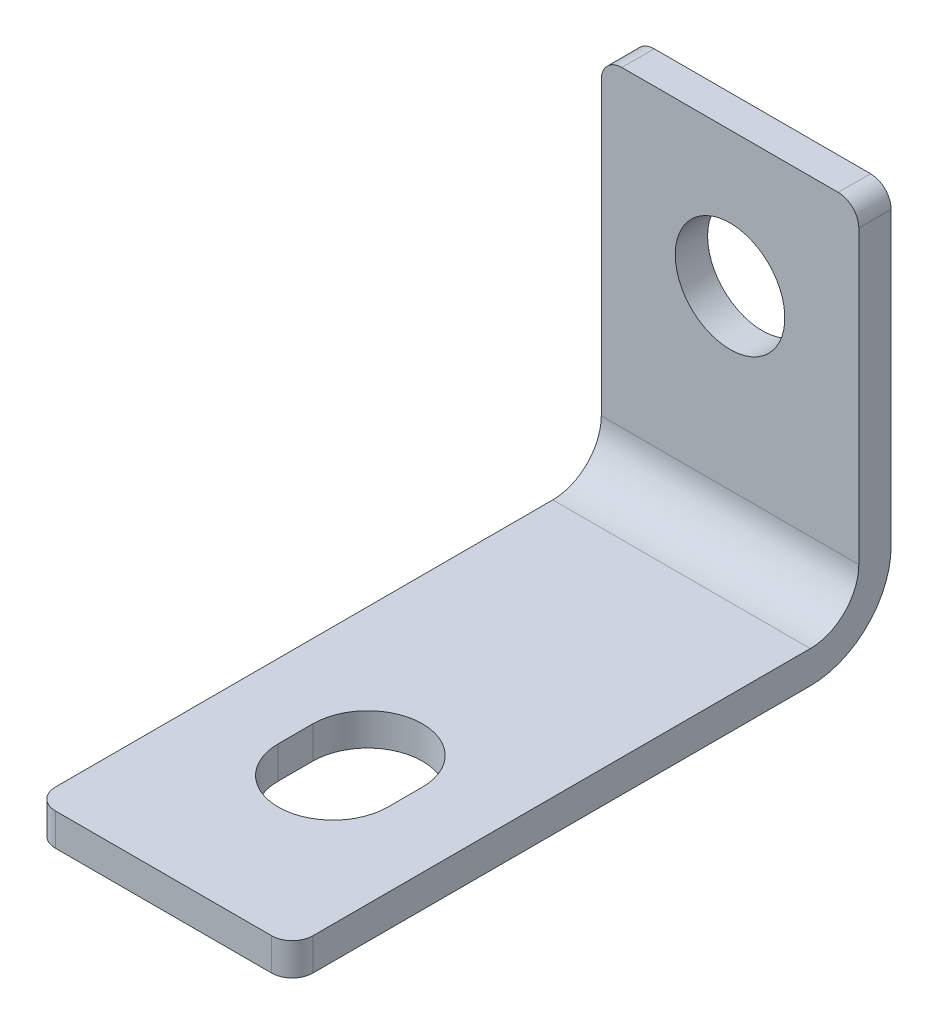
ISO-10303-21;
HEADER;
FILE_DESCRIPTION(('STEP AP214'),'2;1');
FILE_NAME('part.step','',(''),(''),'','','');
FILE_SCHEMA(('AUTOMOTIVE_DESIGN { 1 0 10303 214 1 1 1 1 }'));
ENDSEC;
DATA;
#1=APPLICATION_CONTEXT('core data for automotive mechanical design processes');
#2=APPLICATION_PROTOCOL_DEFINITION('international standard','automotive_design',2000,#1);
#3=PRODUCT_CONTEXT('',#1,'mechanical');
#4=PRODUCT('Part','Part','',(#3));
#5=PRODUCT_RELATED_PRODUCT_CATEGORY('part','',(#4));
#6=PRODUCT_DEFINITION_FORMATION('','',#4);
#7=PRODUCT_DEFINITION_CONTEXT('part definition',#1,'design');
#8=PRODUCT_DEFINITION('design','',#6,#7);
#9=PRODUCT_DEFINITION_SHAPE('','',#8);
#10=(LENGTH_UNIT() NAMED_UNIT(*) SI_UNIT(.MILLI.,.METRE.));
#11=(NAMED_UNIT(*) PLANE_ANGLE_UNIT() SI_UNIT($,.RADIAN.));
#12=(NAMED_UNIT(*) SI_UNIT($,.STERADIAN.) SOLID_ANGLE_UNIT());
#13=UNCERTAINTY_MEASURE_WITH_UNIT(LENGTH_MEASURE(1.E-05),#10,'distance_accuracy_value','');
#14=(GEOMETRIC_REPRESENTATION_CONTEXT(3) GLOBAL_UNCERTAINTY_ASSIGNED_CONTEXT((#13)) GLOBAL_UNIT_ASSIGNED_CONTEXT((#10,
#11,#12)) REPRESENTATION_CONTEXT('',''));
#15=CARTESIAN_POINT('',(0.,0.,0.));
#16=DIRECTION('',(0.,0.,1.));
#17=DIRECTION('',(1.,0.,0.));
#18=AXIS2_PLACEMENT_3D('',#15,#16,#17);
#19=CARTESIAN_POINT('',(15.875,0.,-1.9939));
#20=DIRECTION('',(0.,0.,1.));
#21=DIRECTION('',(1.,0.,0.));
#22=AXIS2_PLACEMENT_3D('',#19,#20,#21);
#23=PLANE('',#22);
#24=CARTESIAN_POINT('',(14.605,20.955,-1.9939));
#25=DIRECTION('',(0.,0.,-1.));
#26=DIRECTION('',(-1.,0.,0.));
#27=AXIS2_PLACEMENT_3D('',#24,#25,#26);
#28=CIRCLE('',#27,1.27);
#29=CARTESIAN_POINT('',(15.875,20.955,-1.9939));
#30=VERTEX_POINT('',#29);
#31=CARTESIAN_POINT('',(14.605,22.225,-1.9939));
#32=VERTEX_POINT('',#31);
#33=EDGE_CURVE('E128',#30,#32,#28,.F.);
#34=ORIENTED_EDGE('',*,*,#33,.F.);
#35=DIRECTION('',(0.,1.,0.));
#36=VECTOR('',#35,1.);
#37=CARTESIAN_POINT('',(15.875,-1.9939,-1.9939));
#38=LINE('',#37,#36);
#39=CARTESIAN_POINT('',(15.875,2.99085,-1.9939));
#40=VERTEX_POINT('',#39);
#41=EDGE_CURVE('E132',#40,#30,#38,.T.);
#42=ORIENTED_EDGE('',*,*,#41,.F.);
#43=DIRECTION('',(-1.,0.,0.));
#44=VECTOR('',#43,1.);
#45=CARTESIAN_POINT('',(15.875,2.99085,-1.9939));
#46=LINE('',#45,#44);
#47=CARTESIAN_POINT('',(0.,2.99085,-1.9939));
#48=VERTEX_POINT('',#47);
#49=EDGE_CURVE('E221',#48,#40,#46,.F.);
#50=ORIENTED_EDGE('',*,*,#49,.F.);
#51=DIRECTION('',(0.,1.,0.));
#52=VECTOR('',#51,1.);
#53=CARTESIAN_POINT('',(0.,2.99085,-1.9939));
#54=LINE('',#53,#52);
#55=CARTESIAN_POINT('',(0.,20.955,-1.9939));
#56=VERTEX_POINT('',#55);
#57=EDGE_CURVE('E161',#56,#48,#54,.F.);
#58=ORIENTED_EDGE('',*,*,#57,.F.);
#59=CARTESIAN_POINT('',(1.27,20.955,-1.9939));
#60=DIRECTION('',(0.,0.,-1.));
#61=DIRECTION('',(-1.,0.,0.));
#62=AXIS2_PLACEMENT_3D('',#59,#60,#61);
#63=CIRCLE('',#62,1.27);
#64=CARTESIAN_POINT('',(1.27,22.225,-1.9939));
#65=VERTEX_POINT('',#64);
#66=EDGE_CURVE('E155',#65,#56,#63,.F.);
#67=ORIENTED_EDGE('',*,*,#66,.F.);
#68=DIRECTION('',(1.,0.,0.));
#69=VECTOR('',#68,1.);
#70=CARTESIAN_POINT('',(15.875,22.225,-1.9939));
#71=LINE('',#70,#69);
#72=EDGE_CURVE('E135',#32,#65,#71,.F.);
#73=ORIENTED_EDGE('',*,*,#72,.F.);
#74=EDGE_LOOP('',(#34,#42,#50,#58,#67,#73));
#75=FACE_BOUND('',#74,.T.);
#76=CARTESIAN_POINT('',(7.9375,13.8811,-1.9939));
#77=DIRECTION('',(0.,0.,-1.));
#78=DIRECTION('',(-1.,0.,0.));
#79=AXIS2_PLACEMENT_3D('',#76,#77,#78);
#80=CIRCLE('',#79,3.3782);
#81=CARTESIAN_POINT('',(4.5593,13.8811,-1.9939));
#82=VERTEX_POINT('',#81);
#83=EDGE_CURVE('E139',#82,#82,#80,.F.);
#84=ORIENTED_EDGE('',*,*,#83,.T.);
#85=EDGE_LOOP('',(#84));
#86=FACE_BOUND('',#85,.T.);
#87=ADVANCED_FACE('F17',(#75,#86),#23,.F.);
#88=CARTESIAN_POINT('',(7.9375,13.8811,-1.9939));
#89=DIRECTION('',(0.,0.,-1.));
#90=DIRECTION('',(-1.,0.,0.));
#91=AXIS2_PLACEMENT_3D('',#88,#89,#90);
#92=CYLINDRICAL_SURFACE('',#91,3.3782);
#93=ORIENTED_EDGE('',*,*,#83,.F.);
#94=EDGE_LOOP('',(#93));
#95=FACE_BOUND('',#94,.T.);
#96=CARTESIAN_POINT('',(7.9375,13.8811,0.));
#97=DIRECTION('',(0.,0.,-1.));
#98=DIRECTION('',(-1.,0.,0.));
#99=AXIS2_PLACEMENT_3D('',#96,#97,#98);
#100=CIRCLE('',#99,3.3782);
#101=CARTESIAN_POINT('',(4.5593,13.8811,0.));
#102=VERTEX_POINT('',#101);
#103=EDGE_CURVE('E218',#102,#102,#100,.T.);
#104=ORIENTED_EDGE('',*,*,#103,.F.);
#105=EDGE_LOOP('',(#104));
#106=FACE_BOUND('',#105,.T.);
#107=ADVANCED_FACE('F226',(#95,#106),#92,.F.);
#108=CARTESIAN_POINT('',(14.605,20.955,0.));
#109=DIRECTION('',(0.,0.,-1.));
#110=DIRECTION('',(-1.,0.,0.));
#111=AXIS2_PLACEMENT_3D('',#108,#109,#110);
#112=CYLINDRICAL_SURFACE('',#111,1.27);
#113=ORIENTED_EDGE('',*,*,#33,.T.);
#114=DIRECTION('',(0.,0.,1.));
#115=VECTOR('',#114,1.);
#116=CARTESIAN_POINT('',(14.605,22.225,0.));
#117=LINE('',#116,#115);
#118=CARTESIAN_POINT('',(14.605,22.225,0.));
#119=VERTEX_POINT('',#118);
#120=EDGE_CURVE('E138',#119,#32,#117,.F.);
#121=ORIENTED_EDGE('',*,*,#120,.F.);
#122=CARTESIAN_POINT('',(14.605,20.955,0.));
#123=DIRECTION('',(0.,0.,-1.));
#124=DIRECTION('',(-1.,0.,0.));
#125=AXIS2_PLACEMENT_3D('',#122,#123,#124);
#126=CIRCLE('',#125,1.27);
#127=CARTESIAN_POINT('',(15.875,20.955,0.));
#128=VERTEX_POINT('',#127);
#129=EDGE_CURVE('E145',#128,#119,#126,.F.);
#130=ORIENTED_EDGE('',*,*,#129,.F.);
#131=DIRECTION('',(0.,0.,-1.));
#132=VECTOR('',#131,1.);
#133=CARTESIAN_POINT('',(15.875,20.955,2.99085));
#134=LINE('',#133,#132);
#135=EDGE_CURVE('E142',#30,#128,#134,.F.);
#136=ORIENTED_EDGE('',*,*,#135,.F.);
#137=EDGE_LOOP('',(#113,#121,#130,#136));
#138=FACE_BOUND('',#137,.T.);
#139=ADVANCED_FACE('F143',(#138),#112,.T.);
#140=CARTESIAN_POINT('',(15.875,22.225,0.));
#141=DIRECTION('',(0.,1.,0.));
#142=DIRECTION('',(0.,0.,1.));
#143=AXIS2_PLACEMENT_3D('',#140,#141,#142);
#144=PLANE('',#143);
#145=ORIENTED_EDGE('',*,*,#72,.T.);
#146=DIRECTION('',(0.,0.,-1.));
#147=VECTOR('',#146,1.);
#148=CARTESIAN_POINT('',(1.27,22.225,2.99085));
#149=LINE('',#148,#147);
#150=CARTESIAN_POINT('',(1.27,22.225,0.));
#151=VERTEX_POINT('',#150);
#152=EDGE_CURVE('E157',#151,#65,#149,.T.);
#153=ORIENTED_EDGE('',*,*,#152,.F.);
#154=DIRECTION('',(1.,0.,0.));
#155=VECTOR('',#154,1.);
#156=CARTESIAN_POINT('',(15.875,22.225,0.));
#157=LINE('',#156,#155);
#158=EDGE_CURVE('E215',#119,#151,#157,.F.);
#159=ORIENTED_EDGE('',*,*,#158,.F.);
#160=ORIENTED_EDGE('',*,*,#120,.T.);
#161=EDGE_LOOP('',(#145,#153,#159,#160));
#162=FACE_BOUND('',#161,.T.);
#163=ADVANCED_FACE('F359',(#162),#144,.T.);
#164=CARTESIAN_POINT('',(1.27,20.955,2.99085));
#165=DIRECTION('',(0.,0.,-1.));
#166=DIRECTION('',(-1.,0.,0.));
#167=AXIS2_PLACEMENT_3D('',#164,#165,#166);
#168=CYLINDRICAL_SURFACE('',#167,1.27);
#169=ORIENTED_EDGE('',*,*,#66,.T.);
#170=DIRECTION('',(0.,0.,1.));
#171=VECTOR('',#170,1.);
#172=CARTESIAN_POINT('',(0.,20.955,2.99085));
#173=LINE('',#172,#171);
#174=CARTESIAN_POINT('',(0.,20.955,0.));
#175=VERTEX_POINT('',#174);
#176=EDGE_CURVE('E148',#175,#56,#173,.F.);
#177=ORIENTED_EDGE('',*,*,#176,.F.);
#178=CARTESIAN_POINT('',(1.27,20.955,0.));
#179=DIRECTION('',(0.,0.,-1.));
#180=DIRECTION('',(-1.,0.,0.));
#181=AXIS2_PLACEMENT_3D('',#178,#179,#180);
#182=CIRCLE('',#181,1.27);
#183=EDGE_CURVE('E212',#151,#175,#182,.F.);
#184=ORIENTED_EDGE('',*,*,#183,.F.);
#185=ORIENTED_EDGE('',*,*,#152,.T.);
#186=EDGE_LOOP('',(#169,#177,#184,#185));
#187=FACE_BOUND('',#186,.T.);
#188=ADVANCED_FACE('F245',(#187),#168,.T.);
#189=CARTESIAN_POINT('',(15.875,2.99085,2.99085));
#190=DIRECTION('',(-1.,0.,0.));
#191=DIRECTION('',(0.,0.,1.));
#192=AXIS2_PLACEMENT_3D('',#189,#190,#191);
#193=CYLINDRICAL_SURFACE('',#192,4.98475);
#194=CARTESIAN_POINT('',(15.875,2.99085,2.99085));
#195=DIRECTION('',(-1.,0.,0.));
#196=DIRECTION('',(0.,0.,1.));
#197=AXIS2_PLACEMENT_3D('',#194,#195,#196);
#198=CIRCLE('',#197,4.98475);
#199=CARTESIAN_POINT('',(15.875,-1.9939,2.99085));
#200=VERTEX_POINT('',#199);
#201=EDGE_CURVE('E154',#200,#40,#198,.F.);
#202=ORIENTED_EDGE('',*,*,#201,.F.);
#203=DIRECTION('',(1.,0.,0.));
#204=VECTOR('',#203,1.);
#205=CARTESIAN_POINT('',(15.875,-1.9939,2.99085));
#206=LINE('',#205,#204);
#207=CARTESIAN_POINT('',(0.,-1.9939,2.99085));
#208=VERTEX_POINT('',#207);
#209=EDGE_CURVE('E209',#200,#208,#206,.F.);
#210=ORIENTED_EDGE('',*,*,#209,.T.);
#211=CARTESIAN_POINT('',(0.,2.99085,2.99085));
#212=DIRECTION('',(-1.,0.,0.));
#213=DIRECTION('',(0.,0.,1.));
#214=AXIS2_PLACEMENT_3D('',#211,#212,#213);
#215=CIRCLE('',#214,4.98475);
#216=EDGE_CURVE('E206',#48,#208,#215,.T.);
#217=ORIENTED_EDGE('',*,*,#216,.F.);
#218=ORIENTED_EDGE('',*,*,#49,.T.);
#219=EDGE_LOOP('',(#202,#210,#217,#218));
#220=FACE_BOUND('',#219,.T.);
#221=ADVANCED_FACE('F234',(#220),#193,.T.);
#222=CARTESIAN_POINT('',(15.875,0.,0.));
#223=DIRECTION('',(0.,0.,1.));
#224=DIRECTION('',(1.,0.,0.));
#225=AXIS2_PLACEMENT_3D('',#222,#223,#224);
#226=PLANE('',#225);
#227=DIRECTION('',(0.,1.,0.));
#228=VECTOR('',#227,1.);
#229=CARTESIAN_POINT('',(0.,0.,0.));
#230=LINE('',#229,#228);
#231=CARTESIAN_POINT('',(0.,2.99085,0.));
#232=VERTEX_POINT('',#231);
#233=EDGE_CURVE('E211',#175,#232,#230,.F.);
#234=ORIENTED_EDGE('',*,*,#233,.T.);
#235=DIRECTION('',(-1.,0.,0.));
#236=VECTOR('',#235,1.);
#237=CARTESIAN_POINT('',(15.875,2.99085,0.));
#238=LINE('',#237,#236);
#239=CARTESIAN_POINT('',(15.875,2.99085,0.));
#240=VERTEX_POINT('',#239);
#241=EDGE_CURVE('E192',#232,#240,#238,.F.);
#242=ORIENTED_EDGE('',*,*,#241,.T.);
#243=DIRECTION('',(0.,1.,0.));
#244=VECTOR('',#243,1.);
#245=CARTESIAN_POINT('',(15.875,0.,0.));
#246=LINE('',#245,#244);
#247=EDGE_CURVE('E217',#240,#128,#246,.T.);
#248=ORIENTED_EDGE('',*,*,#247,.T.);
#249=ORIENTED_EDGE('',*,*,#129,.T.);
#250=ORIENTED_EDGE('',*,*,#158,.T.);
#251=ORIENTED_EDGE('',*,*,#183,.T.);
#252=EDGE_LOOP('',(#234,#242,#248,#249,#250,#251));
#253=FACE_BOUND('',#252,.T.);
#254=ORIENTED_EDGE('',*,*,#103,.T.);
#255=EDGE_LOOP('',(#254));
#256=FACE_BOUND('',#255,.T.);
#257=ADVANCED_FACE('F231',(#253,#256),#226,.T.);
#258=CARTESIAN_POINT('',(15.875,-1.9939,34.925));
#259=DIRECTION('',(0.,1.,0.));
#260=DIRECTION('',(0.,0.,1.));
#261=AXIS2_PLACEMENT_3D('',#258,#259,#260);
#262=PLANE('',#261);
#263=CARTESIAN_POINT('',(14.605,-1.9939,33.655));
#264=DIRECTION('',(0.,-1.,0.));
#265=DIRECTION('',(0.,0.,-1.));
#266=AXIS2_PLACEMENT_3D('',#263,#264,#265);
#267=CIRCLE('',#266,1.27);
#268=CARTESIAN_POINT('',(14.605,-1.9939,34.925));
#269=VERTEX_POINT('',#268);
#270=CARTESIAN_POINT('',(15.875,-1.9939,33.655));
#271=VERTEX_POINT('',#270);
#272=EDGE_CURVE('E193',#269,#271,#267,.F.);
#273=ORIENTED_EDGE('',*,*,#272,.F.);
#274=DIRECTION('',(1.,0.,0.));
#275=VECTOR('',#274,1.);
#276=CARTESIAN_POINT('',(15.875,-1.9939,34.925));
#277=LINE('',#276,#275);
#278=CARTESIAN_POINT('',(1.27,-1.9939,34.925));
#279=VERTEX_POINT('',#278);
#280=EDGE_CURVE('E197',#279,#269,#277,.T.);
#281=ORIENTED_EDGE('',*,*,#280,.F.);
#282=CARTESIAN_POINT('',(1.27,-1.9939,33.655));
#283=DIRECTION('',(0.,1.,0.));
#284=DIRECTION('',(0.,0.,1.));
#285=AXIS2_PLACEMENT_3D('',#282,#283,#284);
#286=CIRCLE('',#285,1.27);
#287=CARTESIAN_POINT('',(0.,-1.9939,33.655));
#288=VERTEX_POINT('',#287);
#289=EDGE_CURVE('E182',#288,#279,#286,.T.);
#290=ORIENTED_EDGE('',*,*,#289,.F.);
#291=DIRECTION('',(0.,0.,1.));
#292=VECTOR('',#291,1.);
#293=CARTESIAN_POINT('',(0.,-1.9939,-1.9939));
#294=LINE('',#293,#292);
#295=EDGE_CURVE('E186',#208,#288,#294,.T.);
#296=ORIENTED_EDGE('',*,*,#295,.F.);
#297=ORIENTED_EDGE('',*,*,#209,.F.);
#298=DIRECTION('',(0.,0.,1.));
#299=VECTOR('',#298,1.);
#300=CARTESIAN_POINT('',(15.875,-1.9939,2.99085));
#301=LINE('',#300,#299);
#302=EDGE_CURVE('E323',#200,#271,#301,.T.);
#303=ORIENTED_EDGE('',*,*,#302,.T.);
#304=EDGE_LOOP('',(#273,#281,#290,#296,#297,#303));
#305=FACE_BOUND('',#304,.T.);
#306=CARTESIAN_POINT('',(7.9375,-1.9939,24.4729));
#307=DIRECTION('',(0.,1.,0.));
#308=DIRECTION('',(0.,0.,1.));
#309=AXIS2_PLACEMENT_3D('',#306,#307,#308);
#310=CIRCLE('',#309,3.3782);
#311=CARTESIAN_POINT('',(4.5593,-1.9939,24.4729));
#312=VERTEX_POINT('',#311);
#313=CARTESIAN_POINT('',(11.3157,-1.9939,24.4729));
#314=VERTEX_POINT('',#313);
#315=EDGE_CURVE('E202',#312,#314,#310,.T.);
#316=ORIENTED_EDGE('',*,*,#315,.T.);
#317=DIRECTION('',(0.,0.,1.));
#318=VECTOR('',#317,1.);
#319=CARTESIAN_POINT('',(11.3157,-1.9939,24.4729));
#320=LINE('',#319,#318);
#321=CARTESIAN_POINT('',(11.3157,-1.9939,22.3393));
#322=VERTEX_POINT('',#321);
#323=EDGE_CURVE('E205',#314,#322,#320,.F.);
#324=ORIENTED_EDGE('',*,*,#323,.T.);
#325=CARTESIAN_POINT('',(7.9375,-1.9939,22.3393));
#326=DIRECTION('',(0.,1.,0.));
#327=DIRECTION('',(0.,0.,1.));
#328=AXIS2_PLACEMENT_3D('',#325,#326,#327);
#329=CIRCLE('',#328,3.3782);
#330=CARTESIAN_POINT('',(4.5593,-1.9939,22.3393));
#331=VERTEX_POINT('',#330);
#332=EDGE_CURVE('E198',#322,#331,#329,.T.);
#333=ORIENTED_EDGE('',*,*,#332,.T.);
#334=DIRECTION('',(0.,0.,1.));
#335=VECTOR('',#334,1.);
#336=CARTESIAN_POINT('',(4.5593,-1.9939,24.4729));
#337=LINE('',#336,#335);
#338=EDGE_CURVE('E305',#331,#312,#337,.T.);
#339=ORIENTED_EDGE('',*,*,#338,.T.);
#340=EDGE_LOOP('',(#316,#324,#333,#339));
#341=FACE_BOUND('',#340,.T.);
#342=ADVANCED_FACE('F233',(#305,#341),#262,.F.);
#343=CARTESIAN_POINT('',(11.3157,-1.9939,24.4729));
#344=DIRECTION('',(1.,0.,0.));
#345=DIRECTION('',(0.,1.,0.));
#346=AXIS2_PLACEMENT_3D('',#343,#344,#345);
#347=PLANE('',#346);
#348=ORIENTED_EDGE('',*,*,#323,.F.);
#349=DIRECTION('',(0.,1.,0.));
#350=VECTOR('',#349,1.);
#351=CARTESIAN_POINT('',(11.3157,0.,24.4729));
#352=LINE('',#351,#350);
#353=CARTESIAN_POINT('',(11.3157,0.,24.4729));
#354=VERTEX_POINT('',#353);
#355=EDGE_CURVE('E204',#314,#354,#352,.T.);
#356=ORIENTED_EDGE('',*,*,#355,.T.);
#357=DIRECTION('',(0.,0.,1.));
#358=VECTOR('',#357,1.);
#359=CARTESIAN_POINT('',(11.3157,0.,34.925));
#360=LINE('',#359,#358);
#361=CARTESIAN_POINT('',(11.3157,0.,22.3393));
#362=VERTEX_POINT('',#361);
#363=EDGE_CURVE('E181',#362,#354,#360,.T.);
#364=ORIENTED_EDGE('',*,*,#363,.F.);
#365=DIRECTION('',(0.,1.,0.));
#366=VECTOR('',#365,1.);
#367=CARTESIAN_POINT('',(11.3157,0.,22.3393));
#368=LINE('',#367,#366);
#369=EDGE_CURVE('E201',#362,#322,#368,.F.);
#370=ORIENTED_EDGE('',*,*,#369,.T.);
#371=EDGE_LOOP('',(#348,#356,#364,#370));
#372=FACE_BOUND('',#371,.T.);
#373=ADVANCED_FACE('F242',(#372),#347,.F.);
#374=CARTESIAN_POINT('',(7.9375,0.,24.4729));
#375=DIRECTION('',(0.,1.,0.));
#376=DIRECTION('',(0.,0.,1.));
#377=AXIS2_PLACEMENT_3D('',#374,#375,#376);
#378=CYLINDRICAL_SURFACE('',#377,3.3782);
#379=ORIENTED_EDGE('',*,*,#355,.F.);
#380=ORIENTED_EDGE('',*,*,#315,.F.);
#381=DIRECTION('',(0.,1.,0.));
#382=VECTOR('',#381,1.);
#383=CARTESIAN_POINT('',(4.5593,0.,24.4729));
#384=LINE('',#383,#382);
#385=CARTESIAN_POINT('',(4.5593,0.,24.4729));
#386=VERTEX_POINT('',#385);
#387=EDGE_CURVE('E307',#312,#386,#384,.T.);
#388=ORIENTED_EDGE('',*,*,#387,.T.);
#389=CARTESIAN_POINT('',(7.9375,0.,24.4729));
#390=DIRECTION('',(0.,1.,0.));
#391=DIRECTION('',(0.,0.,1.));
#392=AXIS2_PLACEMENT_3D('',#389,#390,#391);
#393=CIRCLE('',#392,3.3782);
#394=EDGE_CURVE('E178',#354,#386,#393,.F.);
#395=ORIENTED_EDGE('',*,*,#394,.F.);
#396=EDGE_LOOP('',(#379,#380,#388,#395));
#397=FACE_BOUND('',#396,.T.);
#398=ADVANCED_FACE('F285',(#397),#378,.F.);
#399=CARTESIAN_POINT('',(4.5593,0.,24.4729));
#400=DIRECTION('',(-1.,0.,0.));
#401=DIRECTION('',(0.,0.,1.));
#402=AXIS2_PLACEMENT_3D('',#399,#400,#401);
#403=PLANE('',#402);
#404=DIRECTION('',(0.,0.,1.));
#405=VECTOR('',#404,1.);
#406=CARTESIAN_POINT('',(4.5593,0.,34.925));
#407=LINE('',#406,#405);
#408=CARTESIAN_POINT('',(4.5593,0.,22.3393));
#409=VERTEX_POINT('',#408);
#410=EDGE_CURVE('E177',#386,#409,#407,.F.);
#411=ORIENTED_EDGE('',*,*,#410,.F.);
#412=ORIENTED_EDGE('',*,*,#387,.F.);
#413=ORIENTED_EDGE('',*,*,#338,.F.);
#414=DIRECTION('',(0.,1.,0.));
#415=VECTOR('',#414,1.);
#416=CARTESIAN_POINT('',(4.5593,0.,22.3393));
#417=LINE('',#416,#415);
#418=EDGE_CURVE('E341',#331,#409,#417,.T.);
#419=ORIENTED_EDGE('',*,*,#418,.T.);
#420=EDGE_LOOP('',(#411,#412,#413,#419));
#421=FACE_BOUND('',#420,.T.);
#422=ADVANCED_FACE('F281',(#421),#403,.F.);
#423=CARTESIAN_POINT('',(7.9375,0.,22.3393));
#424=DIRECTION('',(0.,1.,0.));
#425=DIRECTION('',(0.,0.,1.));
#426=AXIS2_PLACEMENT_3D('',#423,#424,#425);
#427=CYLINDRICAL_SURFACE('',#426,3.3782);
#428=ORIENTED_EDGE('',*,*,#369,.F.);
#429=CARTESIAN_POINT('',(7.9375,0.,22.3393));
#430=DIRECTION('',(0.,1.,0.));
#431=DIRECTION('',(0.,0.,1.));
#432=AXIS2_PLACEMENT_3D('',#429,#430,#431);
#433=CIRCLE('',#432,3.3782);
#434=EDGE_CURVE('E174',#409,#362,#433,.F.);
#435=ORIENTED_EDGE('',*,*,#434,.F.);
#436=ORIENTED_EDGE('',*,*,#418,.F.);
#437=ORIENTED_EDGE('',*,*,#332,.F.);
#438=EDGE_LOOP('',(#428,#435,#436,#437));
#439=FACE_BOUND('',#438,.T.);
#440=ADVANCED_FACE('F277',(#439),#427,.F.);
#441=CARTESIAN_POINT('',(15.875,-1.9939,34.925));
#442=DIRECTION('',(0.,0.,1.));
#443=DIRECTION('',(1.,0.,0.));
#444=AXIS2_PLACEMENT_3D('',#441,#442,#443);
#445=PLANE('',#444);
#446=DIRECTION('',(1.,0.,0.));
#447=VECTOR('',#446,1.);
#448=CARTESIAN_POINT('',(15.875,0.,34.925));
#449=LINE('',#448,#447);
#450=CARTESIAN_POINT('',(1.27,0.,34.925));
#451=VERTEX_POINT('',#450);
#452=CARTESIAN_POINT('',(14.605,0.,34.925));
#453=VERTEX_POINT('',#452);
#454=EDGE_CURVE('E173',#451,#453,#449,.T.);
#455=ORIENTED_EDGE('',*,*,#454,.F.);
#456=DIRECTION('',(0.,1.,0.));
#457=VECTOR('',#456,1.);
#458=CARTESIAN_POINT('',(1.27,2.99085,34.925));
#459=LINE('',#458,#457);
#460=EDGE_CURVE('E185',#279,#451,#459,.T.);
#461=ORIENTED_EDGE('',*,*,#460,.F.);
#462=ORIENTED_EDGE('',*,*,#280,.T.);
#463=DIRECTION('',(0.,-1.,0.));
#464=VECTOR('',#463,1.);
#465=CARTESIAN_POINT('',(14.605,-1.9939,34.925));
#466=LINE('',#465,#464);
#467=EDGE_CURVE('E196',#453,#269,#466,.T.);
#468=ORIENTED_EDGE('',*,*,#467,.F.);
#469=EDGE_LOOP('',(#455,#461,#462,#468));
#470=FACE_BOUND('',#469,.T.);
#471=ADVANCED_FACE('F273',(#470),#445,.T.);
#472=CARTESIAN_POINT('',(14.605,-1.9939,33.655));
#473=DIRECTION('',(0.,-1.,0.));
#474=DIRECTION('',(0.,0.,-1.));
#475=AXIS2_PLACEMENT_3D('',#472,#473,#474);
#476=CYLINDRICAL_SURFACE('',#475,1.27);
#477=CARTESIAN_POINT('',(14.605,0.,33.655));
#478=DIRECTION('',(0.,-1.,0.));
#479=DIRECTION('',(0.,0.,-1.));
#480=AXIS2_PLACEMENT_3D('',#477,#478,#479);
#481=CIRCLE('',#480,1.27);
#482=CARTESIAN_POINT('',(15.875,0.,33.655));
#483=VERTEX_POINT('',#482);
#484=EDGE_CURVE('E169',#453,#483,#481,.F.);
#485=ORIENTED_EDGE('',*,*,#484,.F.);
#486=ORIENTED_EDGE('',*,*,#467,.T.);
#487=ORIENTED_EDGE('',*,*,#272,.T.);
#488=DIRECTION('',(0.,1.,0.));
#489=VECTOR('',#488,1.);
#490=CARTESIAN_POINT('',(15.875,2.99085,33.655));
#491=LINE('',#490,#489);
#492=EDGE_CURVE('E318',#271,#483,#491,.T.);
#493=ORIENTED_EDGE('',*,*,#492,.T.);
#494=EDGE_LOOP('',(#485,#486,#487,#493));
#495=FACE_BOUND('',#494,.T.);
#496=ADVANCED_FACE('F270',(#495),#476,.T.);
#497=CARTESIAN_POINT('',(15.875,2.99085,2.99085));
#498=DIRECTION('',(-1.,0.,0.));
#499=DIRECTION('',(0.,0.,1.));
#500=AXIS2_PLACEMENT_3D('',#497,#498,#499);
#501=PLANE('',#500);
#502=ORIENTED_EDGE('',*,*,#492,.F.);
#503=ORIENTED_EDGE('',*,*,#302,.F.);
#504=ORIENTED_EDGE('',*,*,#201,.T.);
#505=ORIENTED_EDGE('',*,*,#41,.T.);
#506=ORIENTED_EDGE('',*,*,#135,.T.);
#507=ORIENTED_EDGE('',*,*,#247,.F.);
#508=CARTESIAN_POINT('',(15.875,2.99085,2.99085));
#509=DIRECTION('',(-1.,0.,0.));
#510=DIRECTION('',(0.,0.,1.));
#511=AXIS2_PLACEMENT_3D('',#508,#509,#510);
#512=CIRCLE('',#511,2.99085);
#513=CARTESIAN_POINT('',(15.875,0.,2.99085));
#514=VERTEX_POINT('',#513);
#515=EDGE_CURVE('E190',#240,#514,#512,.T.);
#516=ORIENTED_EDGE('',*,*,#515,.T.);
#517=DIRECTION('',(0.,0.,1.));
#518=VECTOR('',#517,1.);
#519=CARTESIAN_POINT('',(15.875,0.,34.925));
#520=LINE('',#519,#518);
#521=EDGE_CURVE('E172',#483,#514,#520,.F.);
#522=ORIENTED_EDGE('',*,*,#521,.F.);
#523=EDGE_LOOP('',(#502,#503,#504,#505,#506,#507,#516,#522));
#524=FACE_BOUND('',#523,.T.);
#525=ADVANCED_FACE('F152',(#524),#501,.F.);
#526=CARTESIAN_POINT('',(15.875,2.99085,2.99085));
#527=DIRECTION('',(-1.,0.,0.));
#528=DIRECTION('',(0.,0.,1.));
#529=AXIS2_PLACEMENT_3D('',#526,#527,#528);
#530=CYLINDRICAL_SURFACE('',#529,2.99085);
#531=DIRECTION('',(1.,0.,0.));
#532=VECTOR('',#531,1.);
#533=CARTESIAN_POINT('',(15.875,0.,2.99085));
#534=LINE('',#533,#532);
#535=CARTESIAN_POINT('',(0.,0.,2.99085));
#536=VERTEX_POINT('',#535);
#537=EDGE_CURVE('E335',#514,#536,#534,.F.);
#538=ORIENTED_EDGE('',*,*,#537,.F.);
#539=ORIENTED_EDGE('',*,*,#515,.F.);
#540=ORIENTED_EDGE('',*,*,#241,.F.);
#541=CARTESIAN_POINT('',(0.,2.99085,2.99085));
#542=DIRECTION('',(-1.,0.,0.));
#543=DIRECTION('',(0.,0.,1.));
#544=AXIS2_PLACEMENT_3D('',#541,#542,#543);
#545=CIRCLE('',#544,2.99085);
#546=EDGE_CURVE('E187',#536,#232,#545,.F.);
#547=ORIENTED_EDGE('',*,*,#546,.F.);
#548=EDGE_LOOP('',(#538,#539,#540,#547));
#549=FACE_BOUND('',#548,.T.);
#550=ADVANCED_FACE('F264',(#549),#530,.F.);
#551=CARTESIAN_POINT('',(0.,2.99085,-1.9939));
#552=DIRECTION('',(-1.,0.,0.));
#553=DIRECTION('',(0.,0.,1.));
#554=AXIS2_PLACEMENT_3D('',#551,#552,#553);
#555=PLANE('',#554);
#556=DIRECTION('',(0.,0.,1.));
#557=VECTOR('',#556,1.);
#558=CARTESIAN_POINT('',(0.,0.,34.925));
#559=LINE('',#558,#557);
#560=CARTESIAN_POINT('',(0.,0.,33.655));
#561=VERTEX_POINT('',#560);
#562=EDGE_CURVE('E26',#536,#561,#559,.T.);
#563=ORIENTED_EDGE('',*,*,#562,.F.);
#564=ORIENTED_EDGE('',*,*,#546,.T.);
#565=ORIENTED_EDGE('',*,*,#233,.F.);
#566=ORIENTED_EDGE('',*,*,#176,.T.);
#567=ORIENTED_EDGE('',*,*,#57,.T.);
#568=ORIENTED_EDGE('',*,*,#216,.T.);
#569=ORIENTED_EDGE('',*,*,#295,.T.);
#570=DIRECTION('',(0.,1.,0.));
#571=VECTOR('',#570,1.);
#572=CARTESIAN_POINT('',(0.,2.99085,33.655));
#573=LINE('',#572,#571);
#574=EDGE_CURVE('E35',#561,#288,#573,.F.);
#575=ORIENTED_EDGE('',*,*,#574,.F.);
#576=EDGE_LOOP('',(#563,#564,#565,#566,#567,#568,#569,#575));
#577=FACE_BOUND('',#576,.T.);
#578=ADVANCED_FACE('F256',(#577),#555,.T.);
#579=CARTESIAN_POINT('',(1.27,2.99085,33.655));
#580=DIRECTION('',(0.,1.,0.));
#581=DIRECTION('',(0.,0.,1.));
#582=AXIS2_PLACEMENT_3D('',#579,#580,#581);
#583=CYLINDRICAL_SURFACE('',#582,1.27);
#584=CARTESIAN_POINT('',(1.27,0.,33.655));
#585=DIRECTION('',(0.,1.,0.));
#586=DIRECTION('',(0.,0.,1.));
#587=AXIS2_PLACEMENT_3D('',#584,#585,#586);
#588=CIRCLE('',#587,1.27);
#589=EDGE_CURVE('E11',#561,#451,#588,.T.);
#590=ORIENTED_EDGE('',*,*,#589,.F.);
#591=ORIENTED_EDGE('',*,*,#574,.T.);
#592=ORIENTED_EDGE('',*,*,#289,.T.);
#593=ORIENTED_EDGE('',*,*,#460,.T.);
#594=EDGE_LOOP('',(#590,#591,#592,#593));
#595=FACE_BOUND('',#594,.T.);
#596=ADVANCED_FACE('F250',(#595),#583,.T.);
#597=CARTESIAN_POINT('',(15.875,0.,34.925));
#598=DIRECTION('',(0.,1.,0.));
#599=DIRECTION('',(0.,0.,1.));
#600=AXIS2_PLACEMENT_3D('',#597,#598,#599);
#601=PLANE('',#600);
#602=ORIENTED_EDGE('',*,*,#562,.T.);
#603=ORIENTED_EDGE('',*,*,#589,.T.);
#604=ORIENTED_EDGE('',*,*,#454,.T.);
#605=ORIENTED_EDGE('',*,*,#484,.T.);
#606=ORIENTED_EDGE('',*,*,#521,.T.);
#607=ORIENTED_EDGE('',*,*,#537,.T.);
#608=EDGE_LOOP('',(#602,#603,#604,#605,#606,#607));
#609=FACE_BOUND('',#608,.T.);
#610=ORIENTED_EDGE('',*,*,#410,.T.);
#611=ORIENTED_EDGE('',*,*,#434,.T.);
#612=ORIENTED_EDGE('',*,*,#363,.T.);
#613=ORIENTED_EDGE('',*,*,#394,.T.);
#614=EDGE_LOOP('',(#610,#611,#612,#613));
#615=FACE_BOUND('',#614,.T.);
#616=ADVANCED_FACE('F248',(#609,#615),#601,.T.);
#617=CLOSED_SHELL('',(#87,#107,#139,#163,#188,#221,#257,#342,#373,#398,#422,#440,#471,#496,#525,
#550,#578,#596,#616));
#618=MANIFOLD_SOLID_BREP('B1',#617);
#619=ADVANCED_BREP_SHAPE_REPRESENTATION('',(#18,#618),#14);
#620=SHAPE_DEFINITION_REPRESENTATION(#9,#619);
ENDSEC;
END-ISO-10303-21;
